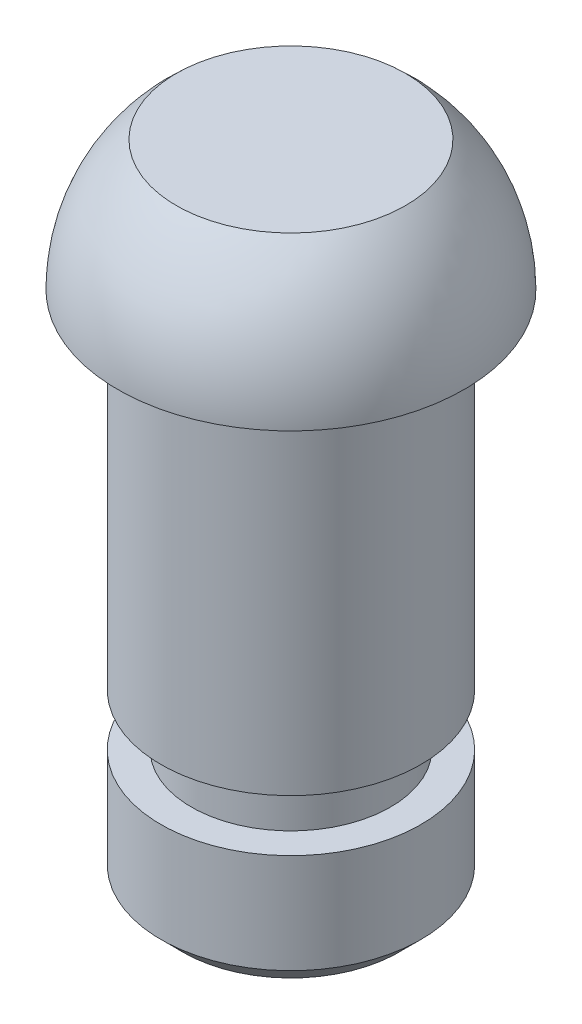
ISO-10303-21;
HEADER;
FILE_DESCRIPTION(('STEP AP214'),'2;1');
FILE_NAME('part.step','',(''),(''),'','','');
FILE_SCHEMA(('AUTOMOTIVE_DESIGN { 1 0 10303 214 1 1 1 1 }'));
ENDSEC;
DATA;
#1=APPLICATION_CONTEXT('core data for automotive mechanical design processes');
#2=APPLICATION_PROTOCOL_DEFINITION('international standard','automotive_design',2000,#1);
#3=PRODUCT_CONTEXT('',#1,'mechanical');
#4=PRODUCT('Part','Part','',(#3));
#5=PRODUCT_RELATED_PRODUCT_CATEGORY('part','',(#4));
#6=PRODUCT_DEFINITION_FORMATION('','',#4);
#7=PRODUCT_DEFINITION_CONTEXT('part definition',#1,'design');
#8=PRODUCT_DEFINITION('design','',#6,#7);
#9=PRODUCT_DEFINITION_SHAPE('','',#8);
#10=(LENGTH_UNIT() NAMED_UNIT(*) SI_UNIT(.MILLI.,.METRE.));
#11=(NAMED_UNIT(*) PLANE_ANGLE_UNIT() SI_UNIT($,.RADIAN.));
#12=(NAMED_UNIT(*) SI_UNIT($,.STERADIAN.) SOLID_ANGLE_UNIT());
#13=UNCERTAINTY_MEASURE_WITH_UNIT(LENGTH_MEASURE(1.E-05),#10,'distance_accuracy_value','');
#14=(GEOMETRIC_REPRESENTATION_CONTEXT(3) GLOBAL_UNCERTAINTY_ASSIGNED_CONTEXT((#13)) GLOBAL_UNIT_ASSIGNED_CONTEXT((#10,
#11,#12)) REPRESENTATION_CONTEXT('',''));
#15=CARTESIAN_POINT('',(0.,0.,0.));
#16=DIRECTION('',(0.,0.,1.));
#17=DIRECTION('',(1.,0.,0.));
#18=AXIS2_PLACEMENT_3D('',#15,#16,#17);
#19=CARTESIAN_POINT('',(1.5,0.,0.));
#20=DIRECTION('',(0.,-1.,0.));
#21=DIRECTION('',(0.,0.,-1.));
#22=AXIS2_PLACEMENT_3D('',#19,#20,#21);
#23=PLANE('',#22);
#24=CARTESIAN_POINT('',(0.,0.,0.));
#25=DIRECTION('',(0.,-1.,0.));
#26=DIRECTION('',(0.,0.,-1.));
#27=AXIS2_PLACEMENT_3D('',#24,#25,#26);
#28=CIRCLE('',#27,1.25);
#29=CARTESIAN_POINT('',(0.,0.,-1.25));
#30=VERTEX_POINT('',#29);
#31=EDGE_CURVE('E40',#30,#30,#28,.T.);
#32=ORIENTED_EDGE('',*,*,#31,.T.);
#33=EDGE_LOOP('',(#32));
#34=FACE_BOUND('',#33,.T.);
#35=ADVANCED_FACE('F32',(#34),#23,.T.);
#36=CARTESIAN_POINT('',(0.,0.,0.));
#37=DIRECTION('',(0.,-1.,0.));
#38=DIRECTION('',(0.,0.,-1.));
#39=AXIS2_PLACEMENT_3D('',#36,#37,#38);
#40=CYLINDRICAL_SURFACE('',#39,1.5);
#41=CARTESIAN_POINT('',(0.,0.249999999999999,0.));
#42=DIRECTION('',(0.,-1.,0.));
#43=DIRECTION('',(0.,0.,-1.));
#44=AXIS2_PLACEMENT_3D('',#41,#42,#43);
#45=CIRCLE('',#44,1.5);
#46=CARTESIAN_POINT('',(0.,0.249999999999999,-1.5));
#47=VERTEX_POINT('',#46);
#48=EDGE_CURVE('E10',#47,#47,#45,.F.);
#49=ORIENTED_EDGE('',*,*,#48,.T.);
#50=EDGE_LOOP('',(#49));
#51=FACE_BOUND('',#50,.T.);
#52=CARTESIAN_POINT('',(0.,1.4,0.));
#53=DIRECTION('',(0.,-1.,0.));
#54=DIRECTION('',(0.,0.,-1.));
#55=AXIS2_PLACEMENT_3D('',#52,#53,#54);
#56=CIRCLE('',#55,1.5);
#57=CARTESIAN_POINT('',(0.,1.4,-1.5));
#58=VERTEX_POINT('',#57);
#59=EDGE_CURVE('E44',#58,#58,#56,.T.);
#60=ORIENTED_EDGE('',*,*,#59,.T.);
#61=EDGE_LOOP('',(#60));
#62=FACE_BOUND('',#61,.T.);
#63=ADVANCED_FACE('F83',(#51,#62),#40,.T.);
#64=CARTESIAN_POINT('',(1.15,1.4,0.));
#65=DIRECTION('',(0.,1.,0.));
#66=DIRECTION('',(0.,0.,1.));
#67=AXIS2_PLACEMENT_3D('',#64,#65,#66);
#68=PLANE('',#67);
#69=CARTESIAN_POINT('',(0.,1.4,0.));
#70=DIRECTION('',(0.,-1.,0.));
#71=DIRECTION('',(0.,0.,-1.));
#72=AXIS2_PLACEMENT_3D('',#69,#70,#71);
#73=CIRCLE('',#72,1.15);
#74=CARTESIAN_POINT('',(0.,1.4,-1.15));
#75=VERTEX_POINT('',#74);
#76=EDGE_CURVE('E48',#75,#75,#73,.T.);
#77=ORIENTED_EDGE('',*,*,#76,.T.);
#78=EDGE_LOOP('',(#77));
#79=FACE_BOUND('',#78,.T.);
#80=ORIENTED_EDGE('',*,*,#59,.F.);
#81=EDGE_LOOP('',(#80));
#82=FACE_BOUND('',#81,.T.);
#83=ADVANCED_FACE('F87',(#79,#82),#68,.T.);
#84=CARTESIAN_POINT('',(0.,0.,0.));
#85=DIRECTION('',(0.,-1.,0.));
#86=DIRECTION('',(0.,0.,-1.));
#87=AXIS2_PLACEMENT_3D('',#84,#85,#86);
#88=CYLINDRICAL_SURFACE('',#87,1.15);
#89=CARTESIAN_POINT('',(0.,2.,0.));
#90=DIRECTION('',(0.,-1.,0.));
#91=DIRECTION('',(0.,0.,-1.));
#92=AXIS2_PLACEMENT_3D('',#89,#90,#91);
#93=CIRCLE('',#92,1.15);
#94=CARTESIAN_POINT('',(0.,2.,-1.15));
#95=VERTEX_POINT('',#94);
#96=EDGE_CURVE('E53',#95,#95,#93,.T.);
#97=ORIENTED_EDGE('',*,*,#96,.T.);
#98=EDGE_LOOP('',(#97));
#99=FACE_BOUND('',#98,.T.);
#100=ORIENTED_EDGE('',*,*,#76,.F.);
#101=EDGE_LOOP('',(#100));
#102=FACE_BOUND('',#101,.T.);
#103=ADVANCED_FACE('F92',(#99,#102),#88,.T.);
#104=CARTESIAN_POINT('',(1.5,2.,0.));
#105=DIRECTION('',(0.,-1.,0.));
#106=DIRECTION('',(0.,0.,-1.));
#107=AXIS2_PLACEMENT_3D('',#104,#105,#106);
#108=PLANE('',#107);
#109=CARTESIAN_POINT('',(0.,2.,0.));
#110=DIRECTION('',(0.,-1.,0.));
#111=DIRECTION('',(0.,0.,-1.));
#112=AXIS2_PLACEMENT_3D('',#109,#110,#111);
#113=CIRCLE('',#112,1.5);
#114=CARTESIAN_POINT('',(0.,2.,-1.5));
#115=VERTEX_POINT('',#114);
#116=EDGE_CURVE('E56',#115,#115,#113,.T.);
#117=ORIENTED_EDGE('',*,*,#116,.T.);
#118=EDGE_LOOP('',(#117));
#119=FACE_BOUND('',#118,.T.);
#120=ORIENTED_EDGE('',*,*,#96,.F.);
#121=EDGE_LOOP('',(#120));
#122=FACE_BOUND('',#121,.T.);
#123=ADVANCED_FACE('F96',(#119,#122),#108,.T.);
#124=CARTESIAN_POINT('',(0.,0.,0.));
#125=DIRECTION('',(0.,-1.,0.));
#126=DIRECTION('',(0.,0.,-1.));
#127=AXIS2_PLACEMENT_3D('',#124,#125,#126);
#128=CYLINDRICAL_SURFACE('',#127,1.5);
#129=CARTESIAN_POINT('',(0.,6.,0.));
#130=DIRECTION('',(0.,-1.,0.));
#131=DIRECTION('',(0.,0.,-1.));
#132=AXIS2_PLACEMENT_3D('',#129,#130,#131);
#133=CIRCLE('',#132,1.5);
#134=CARTESIAN_POINT('',(0.,6.,-1.5));
#135=VERTEX_POINT('',#134);
#136=EDGE_CURVE('E59',#135,#135,#133,.T.);
#137=ORIENTED_EDGE('',*,*,#136,.T.);
#138=EDGE_LOOP('',(#137));
#139=FACE_BOUND('',#138,.T.);
#140=ORIENTED_EDGE('',*,*,#116,.F.);
#141=EDGE_LOOP('',(#140));
#142=FACE_BOUND('',#141,.T.);
#143=ADVANCED_FACE('F100',(#139,#142),#128,.T.);
#144=CARTESIAN_POINT('',(1.5,6.,0.));
#145=DIRECTION('',(0.,-1.,0.));
#146=DIRECTION('',(0.,0.,-1.));
#147=AXIS2_PLACEMENT_3D('',#144,#145,#146);
#148=PLANE('',#147);
#149=CARTESIAN_POINT('',(0.,6.,0.));
#150=DIRECTION('',(0.,-1.,0.));
#151=DIRECTION('',(0.,0.,-1.));
#152=AXIS2_PLACEMENT_3D('',#149,#150,#151);
#153=CIRCLE('',#152,2.);
#154=CARTESIAN_POINT('',(0.,6.,-2.));
#155=VERTEX_POINT('',#154);
#156=EDGE_CURVE('E62',#155,#155,#153,.T.);
#157=ORIENTED_EDGE('',*,*,#156,.T.);
#158=EDGE_LOOP('',(#157));
#159=FACE_BOUND('',#158,.T.);
#160=ORIENTED_EDGE('',*,*,#136,.F.);
#161=EDGE_LOOP('',(#160));
#162=FACE_BOUND('',#161,.T.);
#163=ADVANCED_FACE('F80',(#159,#162),#148,.T.);
#164=CARTESIAN_POINT('',(0.,6.,0.));
#165=DIRECTION('',(0.,-1.,0.));
#166=DIRECTION('',(1.,0.,0.));
#167=AXIS2_PLACEMENT_3D('',#164,#165,#166);
#168=SPHERICAL_SURFACE('',#167,2.);
#169=CARTESIAN_POINT('',(0.,7.5,0.));
#170=DIRECTION('',(0.,-1.,0.));
#171=DIRECTION('',(0.,0.,-1.));
#172=AXIS2_PLACEMENT_3D('',#169,#170,#171);
#173=CIRCLE('',#172,1.3228756555323);
#174=CARTESIAN_POINT('',(0.,7.5,-1.3228756555323));
#175=VERTEX_POINT('',#174);
#176=EDGE_CURVE('E65',#175,#175,#173,.T.);
#177=ORIENTED_EDGE('',*,*,#176,.T.);
#178=EDGE_LOOP('',(#177));
#179=FACE_BOUND('',#178,.T.);
#180=ORIENTED_EDGE('',*,*,#156,.F.);
#181=EDGE_LOOP('',(#180));
#182=FACE_BOUND('',#181,.T.);
#183=ADVANCED_FACE('F69',(#179,#182),#168,.T.);
#184=CARTESIAN_POINT('',(0.,7.5,0.));
#185=DIRECTION('',(0.,1.,0.));
#186=DIRECTION('',(0.,0.,1.));
#187=AXIS2_PLACEMENT_3D('',#184,#185,#186);
#188=PLANE('',#187);
#189=ORIENTED_EDGE('',*,*,#176,.F.);
#190=EDGE_LOOP('',(#189));
#191=FACE_BOUND('',#190,.T.);
#192=ADVANCED_FACE('F72',(#191),#188,.T.);
#193=CARTESIAN_POINT('',(0.,0.,0.));
#194=DIRECTION('',(0.,1.,0.));
#195=DIRECTION('',(0.,0.,1.));
#196=AXIS2_PLACEMENT_3D('',#193,#194,#195);
#197=CONICAL_SURFACE('',#196,1.25,0.785398163397447);
#198=ORIENTED_EDGE('',*,*,#48,.F.);
#199=EDGE_LOOP('',(#198));
#200=FACE_BOUND('',#199,.T.);
#201=ORIENTED_EDGE('',*,*,#31,.F.);
#202=EDGE_LOOP('',(#201));
#203=FACE_BOUND('',#202,.T.);
#204=ADVANCED_FACE('F35',(#200,#203),#197,.T.);
#205=CLOSED_SHELL('',(#35,#63,#83,#103,#123,#143,#163,#183,#192,#204));
#206=MANIFOLD_SOLID_BREP('B2',#205);
#207=ADVANCED_BREP_SHAPE_REPRESENTATION('',(#18,#206),#14);
#208=SHAPE_DEFINITION_REPRESENTATION(#9,#207);
ENDSEC;
END-ISO-10303-21;
